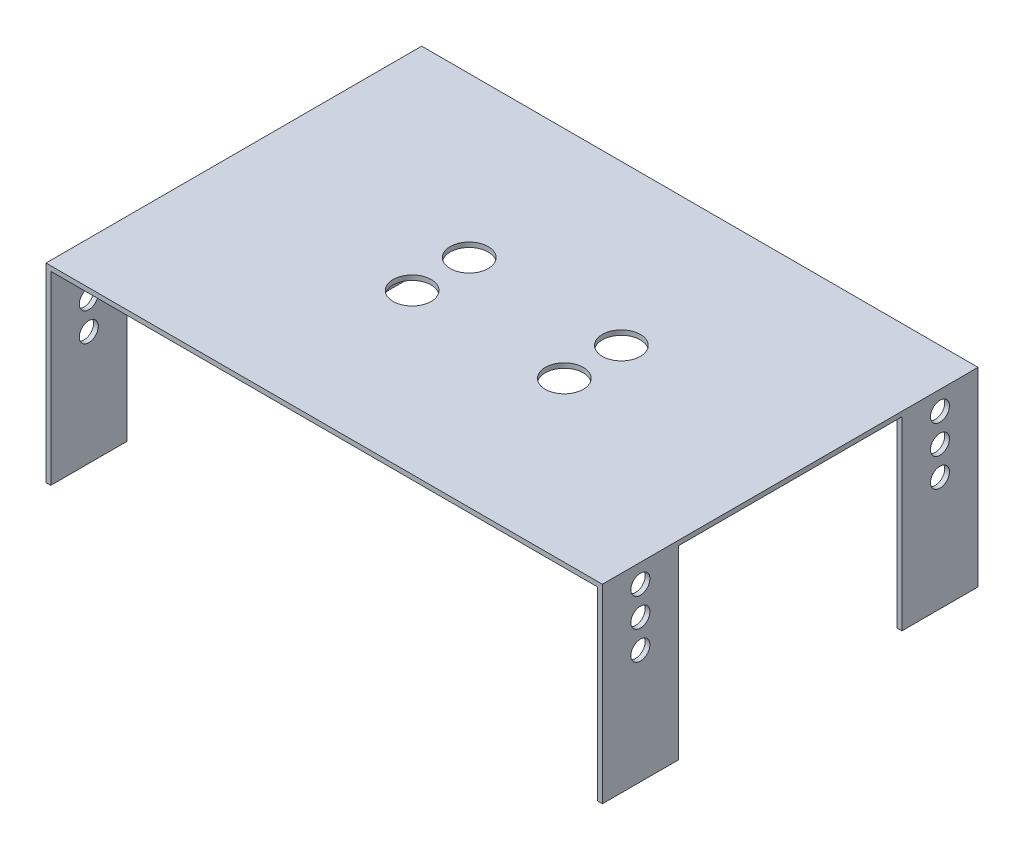
ISO-10303-21;
HEADER;
FILE_DESCRIPTION(('STEP AP214'),'2;1');
FILE_NAME('part.step','',(''),(''),'','','');
FILE_SCHEMA(('AUTOMOTIVE_DESIGN { 1 0 10303 214 1 1 1 1 }'));
ENDSEC;
DATA;
#1=APPLICATION_CONTEXT('core data for automotive mechanical design processes');
#2=APPLICATION_PROTOCOL_DEFINITION('international standard','automotive_design',2000,#1);
#3=PRODUCT_CONTEXT('',#1,'mechanical');
#4=PRODUCT('Part','Part','',(#3));
#5=PRODUCT_RELATED_PRODUCT_CATEGORY('part','',(#4));
#6=PRODUCT_DEFINITION_FORMATION('','',#4);
#7=PRODUCT_DEFINITION_CONTEXT('part definition',#1,'design');
#8=PRODUCT_DEFINITION('design','',#6,#7);
#9=PRODUCT_DEFINITION_SHAPE('','',#8);
#10=(LENGTH_UNIT() NAMED_UNIT(*) SI_UNIT(.MILLI.,.METRE.));
#11=(NAMED_UNIT(*) PLANE_ANGLE_UNIT() SI_UNIT($,.RADIAN.));
#12=(NAMED_UNIT(*) SI_UNIT($,.STERADIAN.) SOLID_ANGLE_UNIT());
#13=UNCERTAINTY_MEASURE_WITH_UNIT(LENGTH_MEASURE(1.E-05),#10,'distance_accuracy_value','');
#14=(GEOMETRIC_REPRESENTATION_CONTEXT(3) GLOBAL_UNCERTAINTY_ASSIGNED_CONTEXT((#13)) GLOBAL_UNIT_ASSIGNED_CONTEXT((#10,
#11,#12)) REPRESENTATION_CONTEXT('',''));
#15=CARTESIAN_POINT('',(0.,0.,0.));
#16=DIRECTION('',(0.,0.,1.));
#17=DIRECTION('',(1.,0.,0.));
#18=AXIS2_PLACEMENT_3D('',#15,#16,#17);
#19=CARTESIAN_POINT('',(0.,-2.5,0.));
#20=DIRECTION('',(0.,1.,0.));
#21=DIRECTION('',(0.,0.,1.));
#22=AXIS2_PLACEMENT_3D('',#19,#20,#21);
#23=PLANE('',#22);
#24=CARTESIAN_POINT('',(-80.,-2.5,30.));
#25=DIRECTION('',(0.,1.,0.));
#26=DIRECTION('',(0.,0.,1.));
#27=AXIS2_PLACEMENT_3D('',#24,#25,#26);
#28=CIRCLE('',#27,20.);
#29=CARTESIAN_POINT('',(-80.,-2.5,50.));
#30=VERTEX_POINT('',#29);
#31=EDGE_CURVE('E474',#30,#30,#28,.T.);
#32=ORIENTED_EDGE('',*,*,#31,.T.);
#33=EDGE_LOOP('',(#32));
#34=FACE_BOUND('',#33,.T.);
#35=CARTESIAN_POINT('',(79.9999999999998,-2.5,30.0000000000005));
#36=DIRECTION('',(0.,1.,0.));
#37=DIRECTION('',(0.,0.,1.));
#38=AXIS2_PLACEMENT_3D('',#35,#36,#37);
#39=CIRCLE('',#38,20.);
#40=CARTESIAN_POINT('',(79.9999999999998,-2.5,50.0000000000005));
#41=VERTEX_POINT('',#40);
#42=EDGE_CURVE('E521',#41,#41,#39,.T.);
#43=ORIENTED_EDGE('',*,*,#42,.T.);
#44=EDGE_LOOP('',(#43));
#45=FACE_BOUND('',#44,.T.);
#46=CARTESIAN_POINT('',(79.9999999999998,-2.5,-30.0000000000005));
#47=DIRECTION('',(0.,1.,0.));
#48=DIRECTION('',(0.,0.,1.));
#49=AXIS2_PLACEMENT_3D('',#46,#47,#48);
#50=CIRCLE('',#49,20.);
#51=CARTESIAN_POINT('',(79.9999999999998,-2.5,-10.0000000000004));
#52=VERTEX_POINT('',#51);
#53=EDGE_CURVE('E524',#52,#52,#50,.T.);
#54=ORIENTED_EDGE('',*,*,#53,.T.);
#55=EDGE_LOOP('',(#54));
#56=FACE_BOUND('',#55,.T.);
#57=CARTESIAN_POINT('',(-80.,-2.5,-30.));
#58=DIRECTION('',(0.,1.,0.));
#59=DIRECTION('',(0.,0.,1.));
#60=AXIS2_PLACEMENT_3D('',#57,#58,#59);
#61=CIRCLE('',#60,20.);
#62=CARTESIAN_POINT('',(-80.,-2.5,-10.));
#63=VERTEX_POINT('',#62);
#64=EDGE_CURVE('E527',#63,#63,#61,.T.);
#65=ORIENTED_EDGE('',*,*,#64,.T.);
#66=EDGE_LOOP('',(#65));
#67=FACE_BOUND('',#66,.T.);
#68=DIRECTION('',(-1.,0.,0.));
#69=VECTOR('',#68,1.);
#70=CARTESIAN_POINT('',(0.,-2.5,-117.501196253295));
#71=LINE('',#70,#69);
#72=CARTESIAN_POINT('',(287.5,-2.5,-117.501196253295));
#73=VERTEX_POINT('',#72);
#74=CARTESIAN_POINT('',(282.5,-2.5,-117.501196253295));
#75=VERTEX_POINT('',#74);
#76=EDGE_CURVE('E193',#73,#75,#71,.T.);
#77=ORIENTED_EDGE('',*,*,#76,.F.);
#78=DIRECTION('',(0.,0.,-1.));
#79=VECTOR('',#78,1.);
#80=CARTESIAN_POINT('',(287.5,-2.5,-197.5));
#81=LINE('',#80,#79);
#82=CARTESIAN_POINT('',(287.5,-2.5,117.501196253295));
#83=VERTEX_POINT('',#82);
#84=EDGE_CURVE('E272',#83,#73,#81,.T.);
#85=ORIENTED_EDGE('',*,*,#84,.F.);
#86=DIRECTION('',(-1.,0.,0.));
#87=VECTOR('',#86,1.);
#88=CARTESIAN_POINT('',(0.,-2.5,117.501196253295));
#89=LINE('',#88,#87);
#90=CARTESIAN_POINT('',(282.5,-2.5,117.501196253295));
#91=VERTEX_POINT('',#90);
#92=EDGE_CURVE('E225',#83,#91,#89,.T.);
#93=ORIENTED_EDGE('',*,*,#92,.T.);
#94=DIRECTION('',(0.,0.,1.));
#95=VECTOR('',#94,1.);
#96=CARTESIAN_POINT('',(282.5,-2.5,-2.95594304467377E-13));
#97=LINE('',#96,#95);
#98=CARTESIAN_POINT('',(282.5,-2.5,197.5));
#99=VERTEX_POINT('',#98);
#100=EDGE_CURVE('E220',#91,#99,#97,.T.);
#101=ORIENTED_EDGE('',*,*,#100,.T.);
#102=DIRECTION('',(1.,0.,0.));
#103=VECTOR('',#102,1.);
#104=CARTESIAN_POINT('',(-297.5,-2.5,197.5));
#105=LINE('',#104,#103);
#106=CARTESIAN_POINT('',(-292.5,-2.5,197.5));
#107=VERTEX_POINT('',#106);
#108=EDGE_CURVE('E276',#107,#99,#105,.T.);
#109=ORIENTED_EDGE('',*,*,#108,.F.);
#110=DIRECTION('',(0.,0.,-1.));
#111=VECTOR('',#110,1.);
#112=CARTESIAN_POINT('',(-292.5,-2.5,-2.02965681668855E-13));
#113=LINE('',#112,#111);
#114=CARTESIAN_POINT('',(-292.5,-2.5,117.501196253295));
#115=VERTEX_POINT('',#114);
#116=EDGE_CURVE('E243',#107,#115,#113,.T.);
#117=ORIENTED_EDGE('',*,*,#116,.T.);
#118=DIRECTION('',(1.,0.,0.));
#119=VECTOR('',#118,1.);
#120=CARTESIAN_POINT('',(0.,-2.5,117.501196253295));
#121=LINE('',#120,#119);
#122=CARTESIAN_POINT('',(-297.5,-2.5,117.501196253295));
#123=VERTEX_POINT('',#122);
#124=EDGE_CURVE('E248',#123,#115,#121,.T.);
#125=ORIENTED_EDGE('',*,*,#124,.F.);
#126=DIRECTION('',(0.,0.,1.));
#127=VECTOR('',#126,1.);
#128=CARTESIAN_POINT('',(-297.5,-2.5,-197.5));
#129=LINE('',#128,#127);
#130=CARTESIAN_POINT('',(-297.5,-2.5,-117.501196253295));
#131=VERTEX_POINT('',#130);
#132=EDGE_CURVE('E286',#131,#123,#129,.T.);
#133=ORIENTED_EDGE('',*,*,#132,.F.);
#134=DIRECTION('',(1.,0.,0.));
#135=VECTOR('',#134,1.);
#136=CARTESIAN_POINT('',(0.,-2.5,-117.501196253295));
#137=LINE('',#136,#135);
#138=CARTESIAN_POINT('',(-292.5,-2.5,-117.501196253295));
#139=VERTEX_POINT('',#138);
#140=EDGE_CURVE('E264',#131,#139,#137,.T.);
#141=ORIENTED_EDGE('',*,*,#140,.T.);
#142=DIRECTION('',(0.,0.,-1.));
#143=VECTOR('',#142,1.);
#144=CARTESIAN_POINT('',(-292.5,-2.5,2.02965681668855E-13));
#145=LINE('',#144,#143);
#146=CARTESIAN_POINT('',(-292.5,-2.5,-197.5));
#147=VERTEX_POINT('',#146);
#148=EDGE_CURVE('E269',#139,#147,#145,.T.);
#149=ORIENTED_EDGE('',*,*,#148,.T.);
#150=DIRECTION('',(-1.,0.,0.));
#151=VECTOR('',#150,1.);
#152=CARTESIAN_POINT('',(-297.5,-2.5,-197.5));
#153=LINE('',#152,#151);
#154=CARTESIAN_POINT('',(282.5,-2.5,-197.5));
#155=VERTEX_POINT('',#154);
#156=EDGE_CURVE('E284',#155,#147,#153,.T.);
#157=ORIENTED_EDGE('',*,*,#156,.F.);
#158=DIRECTION('',(0.,0.,1.));
#159=VECTOR('',#158,1.);
#160=CARTESIAN_POINT('',(282.5,-2.5,0.));
#161=LINE('',#160,#159);
#162=EDGE_CURVE('E202',#155,#75,#161,.T.);
#163=ORIENTED_EDGE('',*,*,#162,.T.);
#164=EDGE_LOOP('',(#77,#85,#93,#101,#109,#117,#125,#133,#141,#149,#157,#163));
#165=FACE_BOUND('',#164,.T.);
#166=ADVANCED_FACE('F52',(#34,#45,#56,#67,#165),#23,.F.);
#167=CARTESIAN_POINT('',(0.,2.5,0.));
#168=DIRECTION('',(0.,1.,0.));
#169=DIRECTION('',(0.,0.,1.));
#170=AXIS2_PLACEMENT_3D('',#167,#168,#169);
#171=PLANE('',#170);
#172=CARTESIAN_POINT('',(-80.,2.5,30.));
#173=DIRECTION('',(0.,1.,0.));
#174=DIRECTION('',(0.,0.,-1.));
#175=AXIS2_PLACEMENT_3D('',#172,#173,#174);
#176=CIRCLE('',#175,20.);
#177=CARTESIAN_POINT('',(-80.,2.5,10.));
#178=VERTEX_POINT('',#177);
#179=EDGE_CURVE('E534',#178,#178,#176,.T.);
#180=ORIENTED_EDGE('',*,*,#179,.F.);
#181=EDGE_LOOP('',(#180));
#182=FACE_BOUND('',#181,.T.);
#183=CARTESIAN_POINT('',(79.9999999999998,2.5,30.0000000000005));
#184=DIRECTION('',(0.,1.,0.));
#185=DIRECTION('',(0.,0.,1.));
#186=AXIS2_PLACEMENT_3D('',#183,#184,#185);
#187=CIRCLE('',#186,20.);
#188=CARTESIAN_POINT('',(79.9999999999998,2.5,50.0000000000005));
#189=VERTEX_POINT('',#188);
#190=EDGE_CURVE('E537',#189,#189,#187,.T.);
#191=ORIENTED_EDGE('',*,*,#190,.F.);
#192=EDGE_LOOP('',(#191));
#193=FACE_BOUND('',#192,.T.);
#194=CARTESIAN_POINT('',(79.9999999999998,2.5,-30.0000000000005));
#195=DIRECTION('',(0.,1.,0.));
#196=DIRECTION('',(0.,0.,-1.));
#197=AXIS2_PLACEMENT_3D('',#194,#195,#196);
#198=CIRCLE('',#197,20.);
#199=CARTESIAN_POINT('',(79.9999999999998,2.5,-50.0000000000005));
#200=VERTEX_POINT('',#199);
#201=EDGE_CURVE('E533',#200,#200,#198,.T.);
#202=ORIENTED_EDGE('',*,*,#201,.F.);
#203=EDGE_LOOP('',(#202));
#204=FACE_BOUND('',#203,.T.);
#205=CARTESIAN_POINT('',(-80.,2.5,-30.));
#206=DIRECTION('',(0.,1.,0.));
#207=DIRECTION('',(0.,0.,1.));
#208=AXIS2_PLACEMENT_3D('',#205,#206,#207);
#209=CIRCLE('',#208,20.);
#210=CARTESIAN_POINT('',(-80.,2.5,-10.));
#211=VERTEX_POINT('',#210);
#212=EDGE_CURVE('E530',#211,#211,#209,.T.);
#213=ORIENTED_EDGE('',*,*,#212,.F.);
#214=EDGE_LOOP('',(#213));
#215=FACE_BOUND('',#214,.T.);
#216=DIRECTION('',(0.,0.,-1.));
#217=VECTOR('',#216,1.);
#218=CARTESIAN_POINT('',(287.5,2.5,-197.5));
#219=LINE('',#218,#217);
#220=CARTESIAN_POINT('',(287.5,2.5,197.5));
#221=VERTEX_POINT('',#220);
#222=CARTESIAN_POINT('',(287.5,2.5,-197.5));
#223=VERTEX_POINT('',#222);
#224=EDGE_CURVE('E273',#221,#223,#219,.T.);
#225=ORIENTED_EDGE('',*,*,#224,.T.);
#226=DIRECTION('',(-1.,0.,0.));
#227=VECTOR('',#226,1.);
#228=CARTESIAN_POINT('',(-297.5,2.5,-197.5));
#229=LINE('',#228,#227);
#230=CARTESIAN_POINT('',(-297.5,2.5,-197.5));
#231=VERTEX_POINT('',#230);
#232=EDGE_CURVE('E275',#223,#231,#229,.T.);
#233=ORIENTED_EDGE('',*,*,#232,.T.);
#234=DIRECTION('',(0.,0.,1.));
#235=VECTOR('',#234,1.);
#236=CARTESIAN_POINT('',(-297.5,2.5,-197.5));
#237=LINE('',#236,#235);
#238=CARTESIAN_POINT('',(-297.5,2.5,197.5));
#239=VERTEX_POINT('',#238);
#240=EDGE_CURVE('E278',#231,#239,#237,.T.);
#241=ORIENTED_EDGE('',*,*,#240,.T.);
#242=DIRECTION('',(1.,0.,0.));
#243=VECTOR('',#242,1.);
#244=CARTESIAN_POINT('',(-297.5,2.5,197.5));
#245=LINE('',#244,#243);
#246=EDGE_CURVE('E280',#239,#221,#245,.T.);
#247=ORIENTED_EDGE('',*,*,#246,.T.);
#248=EDGE_LOOP('',(#225,#233,#241,#247));
#249=FACE_BOUND('',#248,.T.);
#250=ADVANCED_FACE('F363',(#182,#193,#204,#215,#249),#171,.T.);
#251=CARTESIAN_POINT('',(287.5,2.5,-197.5));
#252=DIRECTION('',(-1.,0.,0.));
#253=DIRECTION('',(0.,0.,1.));
#254=AXIS2_PLACEMENT_3D('',#251,#252,#253);
#255=PLANE('',#254);
#256=CARTESIAN_POINT('',(287.5,-47.5,-157.500598126648));
#257=DIRECTION('',(-1.,0.,0.));
#258=DIRECTION('',(0.,0.,1.));
#259=AXIS2_PLACEMENT_3D('',#256,#257,#258);
#260=CIRCLE('',#259,10.);
#261=CARTESIAN_POINT('',(287.5,-47.5,-147.500598126648));
#262=VERTEX_POINT('',#261);
#263=EDGE_CURVE('E480',#262,#262,#260,.T.);
#264=ORIENTED_EDGE('',*,*,#263,.T.);
#265=EDGE_LOOP('',(#264));
#266=FACE_BOUND('',#265,.T.);
#267=CARTESIAN_POINT('',(287.5,-77.5,-157.500598126648));
#268=DIRECTION('',(-1.,0.,0.));
#269=DIRECTION('',(0.,0.,1.));
#270=AXIS2_PLACEMENT_3D('',#267,#268,#269);
#271=CIRCLE('',#270,10.);
#272=CARTESIAN_POINT('',(287.5,-77.5,-147.500598126648));
#273=VERTEX_POINT('',#272);
#274=EDGE_CURVE('E471',#273,#273,#271,.T.);
#275=ORIENTED_EDGE('',*,*,#274,.T.);
#276=EDGE_LOOP('',(#275));
#277=FACE_BOUND('',#276,.T.);
#278=CARTESIAN_POINT('',(287.5,-17.5,157.500598126647));
#279=DIRECTION('',(-1.,0.,0.));
#280=DIRECTION('',(0.,0.,1.));
#281=AXIS2_PLACEMENT_3D('',#278,#279,#280);
#282=CIRCLE('',#281,10.);
#283=CARTESIAN_POINT('',(287.5,-17.5,167.500598126647));
#284=VERTEX_POINT('',#283);
#285=EDGE_CURVE('E467',#284,#284,#282,.T.);
#286=ORIENTED_EDGE('',*,*,#285,.T.);
#287=EDGE_LOOP('',(#286));
#288=FACE_BOUND('',#287,.T.);
#289=CARTESIAN_POINT('',(287.5,-47.5,157.500598126647));
#290=DIRECTION('',(-1.,0.,0.));
#291=DIRECTION('',(0.,0.,1.));
#292=AXIS2_PLACEMENT_3D('',#289,#290,#291);
#293=CIRCLE('',#292,10.);
#294=CARTESIAN_POINT('',(287.5,-47.5,167.500598126647));
#295=VERTEX_POINT('',#294);
#296=EDGE_CURVE('E465',#295,#295,#293,.T.);
#297=ORIENTED_EDGE('',*,*,#296,.T.);
#298=EDGE_LOOP('',(#297));
#299=FACE_BOUND('',#298,.T.);
#300=CARTESIAN_POINT('',(287.5,-77.5,157.500598126647));
#301=DIRECTION('',(-1.,0.,0.));
#302=DIRECTION('',(0.,0.,1.));
#303=AXIS2_PLACEMENT_3D('',#300,#301,#302);
#304=CIRCLE('',#303,10.);
#305=CARTESIAN_POINT('',(287.5,-77.5,167.500598126647));
#306=VERTEX_POINT('',#305);
#307=EDGE_CURVE('E468',#306,#306,#304,.T.);
#308=ORIENTED_EDGE('',*,*,#307,.T.);
#309=EDGE_LOOP('',(#308));
#310=FACE_BOUND('',#309,.T.);
#311=CARTESIAN_POINT('',(287.5,-17.5,-157.500598126648));
#312=DIRECTION('',(-1.,0.,0.));
#313=DIRECTION('',(0.,0.,1.));
#314=AXIS2_PLACEMENT_3D('',#311,#312,#313);
#315=CIRCLE('',#314,10.);
#316=CARTESIAN_POINT('',(287.5,-17.5,-147.500598126648));
#317=VERTEX_POINT('',#316);
#318=EDGE_CURVE('E298',#317,#317,#315,.T.);
#319=ORIENTED_EDGE('',*,*,#318,.T.);
#320=EDGE_LOOP('',(#319));
#321=FACE_BOUND('',#320,.T.);
#322=DIRECTION('',(0.,-1.,0.));
#323=VECTOR('',#322,1.);
#324=CARTESIAN_POINT('',(287.5,2.5,-197.5));
#325=LINE('',#324,#323);
#326=CARTESIAN_POINT('',(287.5,-197.5,-197.5));
#327=VERTEX_POINT('',#326);
#328=EDGE_CURVE('E13',#223,#327,#325,.T.);
#329=ORIENTED_EDGE('',*,*,#328,.F.);
#330=ORIENTED_EDGE('',*,*,#224,.F.);
#331=DIRECTION('',(0.,-1.,0.));
#332=VECTOR('',#331,1.);
#333=CARTESIAN_POINT('',(287.5,2.5,197.5));
#334=LINE('',#333,#332);
#335=CARTESIAN_POINT('',(287.5,-197.5,197.5));
#336=VERTEX_POINT('',#335);
#337=EDGE_CURVE('E282',#221,#336,#334,.T.);
#338=ORIENTED_EDGE('',*,*,#337,.T.);
#339=DIRECTION('',(0.,0.,-1.));
#340=VECTOR('',#339,1.);
#341=CARTESIAN_POINT('',(287.5,-197.5,117.501196253295));
#342=LINE('',#341,#340);
#343=CARTESIAN_POINT('',(287.5,-197.5,117.501196253295));
#344=VERTEX_POINT('',#343);
#345=EDGE_CURVE('E206',#336,#344,#342,.T.);
#346=ORIENTED_EDGE('',*,*,#345,.T.);
#347=DIRECTION('',(0.,1.,0.));
#348=VECTOR('',#347,1.);
#349=CARTESIAN_POINT('',(287.5,2.5,117.501196253295));
#350=LINE('',#349,#348);
#351=EDGE_CURVE('E69',#344,#83,#350,.T.);
#352=ORIENTED_EDGE('',*,*,#351,.T.);
#353=ORIENTED_EDGE('',*,*,#84,.T.);
#354=DIRECTION('',(0.,1.,0.));
#355=VECTOR('',#354,1.);
#356=CARTESIAN_POINT('',(287.5,2.5,-117.501196253295));
#357=LINE('',#356,#355);
#358=CARTESIAN_POINT('',(287.5,-197.5,-117.501196253295));
#359=VERTEX_POINT('',#358);
#360=EDGE_CURVE('E198',#359,#73,#357,.T.);
#361=ORIENTED_EDGE('',*,*,#360,.F.);
#362=DIRECTION('',(0.,0.,1.));
#363=VECTOR('',#362,1.);
#364=CARTESIAN_POINT('',(287.5,-197.5,-117.501196253295));
#365=LINE('',#364,#363);
#366=EDGE_CURVE('E186',#327,#359,#365,.T.);
#367=ORIENTED_EDGE('',*,*,#366,.F.);
#368=EDGE_LOOP('',(#329,#330,#338,#346,#352,#353,#361,#367));
#369=FACE_BOUND('',#368,.T.);
#370=ADVANCED_FACE('F54',(#266,#277,#288,#299,#310,#321,#369),#255,.F.);
#371=CARTESIAN_POINT('',(-297.5,2.5,-197.5));
#372=DIRECTION('',(0.,0.,1.));
#373=DIRECTION('',(1.,0.,0.));
#374=AXIS2_PLACEMENT_3D('',#371,#372,#373);
#375=PLANE('',#374);
#376=DIRECTION('',(0.,-1.,0.));
#377=VECTOR('',#376,1.);
#378=CARTESIAN_POINT('',(-297.5,2.5,-197.5));
#379=LINE('',#378,#377);
#380=CARTESIAN_POINT('',(-297.5,-197.5,-197.5));
#381=VERTEX_POINT('',#380);
#382=EDGE_CURVE('E61',#231,#381,#379,.T.);
#383=ORIENTED_EDGE('',*,*,#382,.F.);
#384=ORIENTED_EDGE('',*,*,#232,.F.);
#385=ORIENTED_EDGE('',*,*,#328,.T.);
#386=DIRECTION('',(1.,0.,0.));
#387=VECTOR('',#386,1.);
#388=CARTESIAN_POINT('',(282.5,-197.5,-197.5));
#389=LINE('',#388,#387);
#390=CARTESIAN_POINT('',(282.5,-197.5,-197.5));
#391=VERTEX_POINT('',#390);
#392=EDGE_CURVE('E189',#391,#327,#389,.T.);
#393=ORIENTED_EDGE('',*,*,#392,.F.);
#394=DIRECTION('',(0.,-1.,0.));
#395=VECTOR('',#394,1.);
#396=CARTESIAN_POINT('',(282.5,-197.5,-197.5));
#397=LINE('',#396,#395);
#398=EDGE_CURVE('E177',#155,#391,#397,.T.);
#399=ORIENTED_EDGE('',*,*,#398,.F.);
#400=ORIENTED_EDGE('',*,*,#156,.T.);
#401=DIRECTION('',(0.,-1.,0.));
#402=VECTOR('',#401,1.);
#403=CARTESIAN_POINT('',(-292.5,-197.5,-197.5));
#404=LINE('',#403,#402);
#405=CARTESIAN_POINT('',(-292.5,-197.5,-197.5));
#406=VERTEX_POINT('',#405);
#407=EDGE_CURVE('E251',#147,#406,#404,.T.);
#408=ORIENTED_EDGE('',*,*,#407,.T.);
#409=DIRECTION('',(-1.,0.,0.));
#410=VECTOR('',#409,1.);
#411=CARTESIAN_POINT('',(-292.5,-197.5,-197.5));
#412=LINE('',#411,#410);
#413=EDGE_CURVE('E259',#406,#381,#412,.T.);
#414=ORIENTED_EDGE('',*,*,#413,.T.);
#415=EDGE_LOOP('',(#383,#384,#385,#393,#399,#400,#408,#414));
#416=FACE_BOUND('',#415,.T.);
#417=ADVANCED_FACE('F381',(#416),#375,.F.);
#418=CARTESIAN_POINT('',(-297.5,2.5,-197.5));
#419=DIRECTION('',(1.,0.,0.));
#420=DIRECTION('',(0.,0.,-1.));
#421=AXIS2_PLACEMENT_3D('',#418,#419,#420);
#422=PLANE('',#421);
#423=CARTESIAN_POINT('',(-297.5,-47.5,-157.500598126648));
#424=DIRECTION('',(1.,0.,0.));
#425=DIRECTION('',(0.,0.,-1.));
#426=AXIS2_PLACEMENT_3D('',#423,#424,#425);
#427=CIRCLE('',#426,10.);
#428=CARTESIAN_POINT('',(-297.5,-47.5,-167.500598126648));
#429=VERTEX_POINT('',#428);
#430=EDGE_CURVE('E312',#429,#429,#427,.T.);
#431=ORIENTED_EDGE('',*,*,#430,.T.);
#432=EDGE_LOOP('',(#431));
#433=FACE_BOUND('',#432,.T.);
#434=CARTESIAN_POINT('',(-297.5,-77.5,-157.500598126648));
#435=DIRECTION('',(1.,0.,0.));
#436=DIRECTION('',(0.,0.,-1.));
#437=AXIS2_PLACEMENT_3D('',#434,#435,#436);
#438=CIRCLE('',#437,10.);
#439=CARTESIAN_POINT('',(-297.5,-77.5,-167.500598126648));
#440=VERTEX_POINT('',#439);
#441=EDGE_CURVE('E308',#440,#440,#438,.T.);
#442=ORIENTED_EDGE('',*,*,#441,.T.);
#443=EDGE_LOOP('',(#442));
#444=FACE_BOUND('',#443,.T.);
#445=CARTESIAN_POINT('',(-297.5,-17.5,157.500598126648));
#446=DIRECTION('',(1.,0.,0.));
#447=DIRECTION('',(0.,0.,-1.));
#448=AXIS2_PLACEMENT_3D('',#445,#446,#447);
#449=CIRCLE('',#448,10.);
#450=CARTESIAN_POINT('',(-297.5,-17.5,147.500598126648));
#451=VERTEX_POINT('',#450);
#452=EDGE_CURVE('E200',#451,#451,#449,.T.);
#453=ORIENTED_EDGE('',*,*,#452,.T.);
#454=EDGE_LOOP('',(#453));
#455=FACE_BOUND('',#454,.T.);
#456=CARTESIAN_POINT('',(-297.5,-47.5,157.500598126648));
#457=DIRECTION('',(1.,0.,0.));
#458=DIRECTION('',(0.,0.,-1.));
#459=AXIS2_PLACEMENT_3D('',#456,#457,#458);
#460=CIRCLE('',#459,10.);
#461=CARTESIAN_POINT('',(-297.5,-47.5,147.500598126648));
#462=VERTEX_POINT('',#461);
#463=EDGE_CURVE('E320',#462,#462,#460,.T.);
#464=ORIENTED_EDGE('',*,*,#463,.T.);
#465=EDGE_LOOP('',(#464));
#466=FACE_BOUND('',#465,.T.);
#467=CARTESIAN_POINT('',(-297.5,-77.5,157.500598126648));
#468=DIRECTION('',(1.,0.,0.));
#469=DIRECTION('',(0.,0.,-1.));
#470=AXIS2_PLACEMENT_3D('',#467,#468,#469);
#471=CIRCLE('',#470,10.);
#472=CARTESIAN_POINT('',(-297.5,-77.5,147.500598126648));
#473=VERTEX_POINT('',#472);
#474=EDGE_CURVE('E316',#473,#473,#471,.T.);
#475=ORIENTED_EDGE('',*,*,#474,.T.);
#476=EDGE_LOOP('',(#475));
#477=FACE_BOUND('',#476,.T.);
#478=CARTESIAN_POINT('',(-297.5,-17.5,-157.500598126648));
#479=DIRECTION('',(1.,0.,0.));
#480=DIRECTION('',(0.,0.,-1.));
#481=AXIS2_PLACEMENT_3D('',#478,#479,#480);
#482=CIRCLE('',#481,10.);
#483=CARTESIAN_POINT('',(-297.5,-17.5,-167.500598126648));
#484=VERTEX_POINT('',#483);
#485=EDGE_CURVE('E303',#484,#484,#482,.T.);
#486=ORIENTED_EDGE('',*,*,#485,.T.);
#487=EDGE_LOOP('',(#486));
#488=FACE_BOUND('',#487,.T.);
#489=DIRECTION('',(0.,-1.,0.));
#490=VECTOR('',#489,1.);
#491=CARTESIAN_POINT('',(-297.5,2.5,197.5));
#492=LINE('',#491,#490);
#493=CARTESIAN_POINT('',(-297.5,-197.5,197.5));
#494=VERTEX_POINT('',#493);
#495=EDGE_CURVE('E291',#239,#494,#492,.T.);
#496=ORIENTED_EDGE('',*,*,#495,.F.);
#497=ORIENTED_EDGE('',*,*,#240,.F.);
#498=ORIENTED_EDGE('',*,*,#382,.T.);
#499=DIRECTION('',(0.,0.,1.));
#500=VECTOR('',#499,1.);
#501=CARTESIAN_POINT('',(-297.5,-197.5,-117.501196253295));
#502=LINE('',#501,#500);
#503=CARTESIAN_POINT('',(-297.5,-197.5,-117.501196253295));
#504=VERTEX_POINT('',#503);
#505=EDGE_CURVE('E250',#381,#504,#502,.T.);
#506=ORIENTED_EDGE('',*,*,#505,.T.);
#507=DIRECTION('',(0.,1.,0.));
#508=VECTOR('',#507,1.);
#509=CARTESIAN_POINT('',(-297.5,2.5,-117.501196253295));
#510=LINE('',#509,#508);
#511=EDGE_CURVE('E77',#504,#131,#510,.T.);
#512=ORIENTED_EDGE('',*,*,#511,.T.);
#513=ORIENTED_EDGE('',*,*,#132,.T.);
#514=DIRECTION('',(0.,1.,0.));
#515=VECTOR('',#514,1.);
#516=CARTESIAN_POINT('',(-297.5,2.5,117.501196253295));
#517=LINE('',#516,#515);
#518=CARTESIAN_POINT('',(-297.5,-197.5,117.501196253295));
#519=VERTEX_POINT('',#518);
#520=EDGE_CURVE('E228',#519,#123,#517,.T.);
#521=ORIENTED_EDGE('',*,*,#520,.F.);
#522=DIRECTION('',(0.,0.,-1.));
#523=VECTOR('',#522,1.);
#524=CARTESIAN_POINT('',(-297.5,-197.5,117.501196253295));
#525=LINE('',#524,#523);
#526=EDGE_CURVE('E232',#494,#519,#525,.T.);
#527=ORIENTED_EDGE('',*,*,#526,.F.);
#528=EDGE_LOOP('',(#496,#497,#498,#506,#512,#513,#521,#527));
#529=FACE_BOUND('',#528,.T.);
#530=ADVANCED_FACE('F337',(#433,#444,#455,#466,#477,#488,#529),#422,.F.);
#531=CARTESIAN_POINT('',(-297.5,2.5,197.5));
#532=DIRECTION('',(0.,0.,-1.));
#533=DIRECTION('',(-1.,0.,0.));
#534=AXIS2_PLACEMENT_3D('',#531,#532,#533);
#535=PLANE('',#534);
#536=ORIENTED_EDGE('',*,*,#108,.T.);
#537=DIRECTION('',(0.,-1.,0.));
#538=VECTOR('',#537,1.);
#539=CARTESIAN_POINT('',(282.5,-197.5,197.5));
#540=LINE('',#539,#538);
#541=CARTESIAN_POINT('',(282.5,-197.5,197.5));
#542=VERTEX_POINT('',#541);
#543=EDGE_CURVE('E207',#99,#542,#540,.T.);
#544=ORIENTED_EDGE('',*,*,#543,.T.);
#545=DIRECTION('',(1.,0.,0.));
#546=VECTOR('',#545,1.);
#547=CARTESIAN_POINT('',(282.5,-197.5,197.5));
#548=LINE('',#547,#546);
#549=EDGE_CURVE('E215',#542,#336,#548,.T.);
#550=ORIENTED_EDGE('',*,*,#549,.T.);
#551=ORIENTED_EDGE('',*,*,#337,.F.);
#552=ORIENTED_EDGE('',*,*,#246,.F.);
#553=ORIENTED_EDGE('',*,*,#495,.T.);
#554=DIRECTION('',(-1.,0.,0.));
#555=VECTOR('',#554,1.);
#556=CARTESIAN_POINT('',(-292.5,-197.5,197.5));
#557=LINE('',#556,#555);
#558=CARTESIAN_POINT('',(-292.5,-197.5,197.5));
#559=VERTEX_POINT('',#558);
#560=EDGE_CURVE('E240',#559,#494,#557,.T.);
#561=ORIENTED_EDGE('',*,*,#560,.F.);
#562=DIRECTION('',(0.,-1.,0.));
#563=VECTOR('',#562,1.);
#564=CARTESIAN_POINT('',(-292.5,-197.5,197.5));
#565=LINE('',#564,#563);
#566=EDGE_CURVE('E229',#107,#559,#565,.T.);
#567=ORIENTED_EDGE('',*,*,#566,.F.);
#568=EDGE_LOOP('',(#536,#544,#550,#551,#552,#553,#561,#567));
#569=FACE_BOUND('',#568,.T.);
#570=ADVANCED_FACE('F375',(#569),#535,.F.);
#571=CARTESIAN_POINT('',(-292.5,0.,2.05732507700405E-13));
#572=DIRECTION('',(1.,0.,0.));
#573=DIRECTION('',(0.,0.,-1.));
#574=AXIS2_PLACEMENT_3D('',#571,#572,#573);
#575=PLANE('',#574);
#576=CARTESIAN_POINT('',(-292.5,-47.5,-157.500598126648));
#577=DIRECTION('',(1.,0.,0.));
#578=DIRECTION('',(0.,0.,-1.));
#579=AXIS2_PLACEMENT_3D('',#576,#577,#578);
#580=CIRCLE('',#579,10.);
#581=CARTESIAN_POINT('',(-292.5,-47.5,-167.500598126648));
#582=VERTEX_POINT('',#581);
#583=EDGE_CURVE('E307',#582,#582,#580,.T.);
#584=ORIENTED_EDGE('',*,*,#583,.F.);
#585=EDGE_LOOP('',(#584));
#586=FACE_BOUND('',#585,.T.);
#587=CARTESIAN_POINT('',(-292.5,-77.5,-157.500598126648));
#588=DIRECTION('',(1.,0.,0.));
#589=DIRECTION('',(0.,0.,-1.));
#590=AXIS2_PLACEMENT_3D('',#587,#588,#589);
#591=CIRCLE('',#590,10.);
#592=CARTESIAN_POINT('',(-292.5,-77.5,-167.500598126648));
#593=VERTEX_POINT('',#592);
#594=EDGE_CURVE('E302',#593,#593,#591,.T.);
#595=ORIENTED_EDGE('',*,*,#594,.F.);
#596=EDGE_LOOP('',(#595));
#597=FACE_BOUND('',#596,.T.);
#598=CARTESIAN_POINT('',(-292.5,-17.5,-157.500598126648));
#599=DIRECTION('',(1.,0.,0.));
#600=DIRECTION('',(0.,0.,-1.));
#601=AXIS2_PLACEMENT_3D('',#598,#599,#600);
#602=CIRCLE('',#601,10.);
#603=CARTESIAN_POINT('',(-292.5,-17.5,-167.500598126648));
#604=VERTEX_POINT('',#603);
#605=EDGE_CURVE('E297',#604,#604,#602,.T.);
#606=ORIENTED_EDGE('',*,*,#605,.F.);
#607=EDGE_LOOP('',(#606));
#608=FACE_BOUND('',#607,.T.);
#609=ORIENTED_EDGE('',*,*,#148,.F.);
#610=DIRECTION('',(0.,1.,0.));
#611=VECTOR('',#610,1.);
#612=CARTESIAN_POINT('',(-292.5,2.5,-117.501196253295));
#613=LINE('',#612,#611);
#614=CARTESIAN_POINT('',(-292.5,-197.5,-117.501196253295));
#615=VERTEX_POINT('',#614);
#616=EDGE_CURVE('E256',#615,#139,#613,.T.);
#617=ORIENTED_EDGE('',*,*,#616,.F.);
#618=DIRECTION('',(0.,0.,1.));
#619=VECTOR('',#618,1.);
#620=CARTESIAN_POINT('',(-292.5,-197.5,-117.501196253295));
#621=LINE('',#620,#619);
#622=EDGE_CURVE('E253',#406,#615,#621,.T.);
#623=ORIENTED_EDGE('',*,*,#622,.F.);
#624=ORIENTED_EDGE('',*,*,#407,.F.);
#625=EDGE_LOOP('',(#609,#617,#623,#624));
#626=FACE_BOUND('',#625,.T.);
#627=ADVANCED_FACE('F378',(#586,#597,#608,#626),#575,.T.);
#628=CARTESIAN_POINT('',(-292.5,2.5,-117.501196253295));
#629=DIRECTION('',(0.,0.,1.));
#630=DIRECTION('',(1.,0.,0.));
#631=AXIS2_PLACEMENT_3D('',#628,#629,#630);
#632=PLANE('',#631);
#633=ORIENTED_EDGE('',*,*,#140,.F.);
#634=ORIENTED_EDGE('',*,*,#511,.F.);
#635=DIRECTION('',(-1.,0.,0.));
#636=VECTOR('',#635,1.);
#637=CARTESIAN_POINT('',(-292.5,-197.5,-117.501196253295));
#638=LINE('',#637,#636);
#639=EDGE_CURVE('E262',#615,#504,#638,.T.);
#640=ORIENTED_EDGE('',*,*,#639,.F.);
#641=ORIENTED_EDGE('',*,*,#616,.T.);
#642=EDGE_LOOP('',(#633,#634,#640,#641));
#643=FACE_BOUND('',#642,.T.);
#644=ADVANCED_FACE('F409',(#643),#632,.T.);
#645=CARTESIAN_POINT('',(-292.5,-197.5,-117.501196253295));
#646=DIRECTION('',(0.,-1.,0.));
#647=DIRECTION('',(0.,0.,-1.));
#648=AXIS2_PLACEMENT_3D('',#645,#646,#647);
#649=PLANE('',#648);
#650=ORIENTED_EDGE('',*,*,#505,.F.);
#651=ORIENTED_EDGE('',*,*,#413,.F.);
#652=ORIENTED_EDGE('',*,*,#622,.T.);
#653=ORIENTED_EDGE('',*,*,#639,.T.);
#654=EDGE_LOOP('',(#650,#651,#652,#653));
#655=FACE_BOUND('',#654,.T.);
#656=ADVANCED_FACE('F411',(#655),#649,.T.);
#657=CARTESIAN_POINT('',(-292.5,2.5,117.501196253295));
#658=DIRECTION('',(0.,0.,1.));
#659=DIRECTION('',(1.,0.,0.));
#660=AXIS2_PLACEMENT_3D('',#657,#658,#659);
#661=PLANE('',#660);
#662=ORIENTED_EDGE('',*,*,#520,.T.);
#663=ORIENTED_EDGE('',*,*,#124,.T.);
#664=DIRECTION('',(0.,1.,0.));
#665=VECTOR('',#664,1.);
#666=CARTESIAN_POINT('',(-292.5,2.5,117.501196253295));
#667=LINE('',#666,#665);
#668=CARTESIAN_POINT('',(-292.5,-197.5,117.501196253295));
#669=VERTEX_POINT('',#668);
#670=EDGE_CURVE('E231',#669,#115,#667,.T.);
#671=ORIENTED_EDGE('',*,*,#670,.F.);
#672=DIRECTION('',(-1.,0.,0.));
#673=VECTOR('',#672,1.);
#674=CARTESIAN_POINT('',(-292.5,-197.5,117.501196253295));
#675=LINE('',#674,#673);
#676=EDGE_CURVE('E237',#669,#519,#675,.T.);
#677=ORIENTED_EDGE('',*,*,#676,.T.);
#678=EDGE_LOOP('',(#662,#663,#671,#677));
#679=FACE_BOUND('',#678,.T.);
#680=ADVANCED_FACE('F413',(#679),#661,.F.);
#681=CARTESIAN_POINT('',(-292.5,0.,-2.05732507700405E-13));
#682=DIRECTION('',(1.,0.,0.));
#683=DIRECTION('',(0.,0.,1.));
#684=AXIS2_PLACEMENT_3D('',#681,#682,#683);
#685=PLANE('',#684);
#686=CARTESIAN_POINT('',(-292.5,-17.5,157.500598126648));
#687=DIRECTION('',(1.,0.,0.));
#688=DIRECTION('',(0.,0.,-1.));
#689=AXIS2_PLACEMENT_3D('',#686,#687,#688);
#690=CIRCLE('',#689,10.);
#691=CARTESIAN_POINT('',(-292.5,-17.5,147.500598126648));
#692=VERTEX_POINT('',#691);
#693=EDGE_CURVE('E332',#692,#692,#690,.T.);
#694=ORIENTED_EDGE('',*,*,#693,.F.);
#695=EDGE_LOOP('',(#694));
#696=FACE_BOUND('',#695,.T.);
#697=CARTESIAN_POINT('',(-292.5,-47.5,157.500598126648));
#698=DIRECTION('',(1.,0.,0.));
#699=DIRECTION('',(0.,0.,-1.));
#700=AXIS2_PLACEMENT_3D('',#697,#698,#699);
#701=CIRCLE('',#700,10.);
#702=CARTESIAN_POINT('',(-292.5,-47.5,147.500598126648));
#703=VERTEX_POINT('',#702);
#704=EDGE_CURVE('E315',#703,#703,#701,.T.);
#705=ORIENTED_EDGE('',*,*,#704,.F.);
#706=EDGE_LOOP('',(#705));
#707=FACE_BOUND('',#706,.T.);
#708=CARTESIAN_POINT('',(-292.5,-77.5,157.500598126648));
#709=DIRECTION('',(1.,0.,0.));
#710=DIRECTION('',(0.,0.,-1.));
#711=AXIS2_PLACEMENT_3D('',#708,#709,#710);
#712=CIRCLE('',#711,10.);
#713=CARTESIAN_POINT('',(-292.5,-77.5,147.500598126648));
#714=VERTEX_POINT('',#713);
#715=EDGE_CURVE('E311',#714,#714,#712,.T.);
#716=ORIENTED_EDGE('',*,*,#715,.F.);
#717=EDGE_LOOP('',(#716));
#718=FACE_BOUND('',#717,.T.);
#719=ORIENTED_EDGE('',*,*,#116,.F.);
#720=ORIENTED_EDGE('',*,*,#566,.T.);
#721=DIRECTION('',(0.,0.,-1.));
#722=VECTOR('',#721,1.);
#723=CARTESIAN_POINT('',(-292.5,-197.5,117.501196253295));
#724=LINE('',#723,#722);
#725=EDGE_CURVE('E235',#559,#669,#724,.T.);
#726=ORIENTED_EDGE('',*,*,#725,.T.);
#727=ORIENTED_EDGE('',*,*,#670,.T.);
#728=EDGE_LOOP('',(#719,#720,#726,#727));
#729=FACE_BOUND('',#728,.T.);
#730=ADVANCED_FACE('F418',(#696,#707,#718,#729),#685,.T.);
#731=CARTESIAN_POINT('',(-292.5,-197.5,117.501196253295));
#732=DIRECTION('',(0.,1.,0.));
#733=DIRECTION('',(0.,0.,1.));
#734=AXIS2_PLACEMENT_3D('',#731,#732,#733);
#735=PLANE('',#734);
#736=ORIENTED_EDGE('',*,*,#526,.T.);
#737=ORIENTED_EDGE('',*,*,#676,.F.);
#738=ORIENTED_EDGE('',*,*,#725,.F.);
#739=ORIENTED_EDGE('',*,*,#560,.T.);
#740=EDGE_LOOP('',(#736,#737,#738,#739));
#741=FACE_BOUND('',#740,.T.);
#742=ADVANCED_FACE('F426',(#741),#735,.F.);
#743=CARTESIAN_POINT('',(282.5,2.5,117.501196253295));
#744=DIRECTION('',(0.,0.,-1.));
#745=DIRECTION('',(-1.,0.,0.));
#746=AXIS2_PLACEMENT_3D('',#743,#744,#745);
#747=PLANE('',#746);
#748=ORIENTED_EDGE('',*,*,#92,.F.);
#749=ORIENTED_EDGE('',*,*,#351,.F.);
#750=DIRECTION('',(1.,0.,0.));
#751=VECTOR('',#750,1.);
#752=CARTESIAN_POINT('',(282.5,-197.5,117.501196253295));
#753=LINE('',#752,#751);
#754=CARTESIAN_POINT('',(282.5,-197.5,117.501196253295));
#755=VERTEX_POINT('',#754);
#756=EDGE_CURVE('E218',#755,#344,#753,.T.);
#757=ORIENTED_EDGE('',*,*,#756,.F.);
#758=DIRECTION('',(0.,1.,0.));
#759=VECTOR('',#758,1.);
#760=CARTESIAN_POINT('',(282.5,2.5,117.501196253295));
#761=LINE('',#760,#759);
#762=EDGE_CURVE('E212',#755,#91,#761,.T.);
#763=ORIENTED_EDGE('',*,*,#762,.T.);
#764=EDGE_LOOP('',(#748,#749,#757,#763));
#765=FACE_BOUND('',#764,.T.);
#766=ADVANCED_FACE('F429',(#765),#747,.T.);
#767=CARTESIAN_POINT('',(282.5,0.,-3.07062386932066E-13));
#768=DIRECTION('',(-1.,0.,0.));
#769=DIRECTION('',(0.,0.,1.));
#770=AXIS2_PLACEMENT_3D('',#767,#768,#769);
#771=PLANE('',#770);
#772=CARTESIAN_POINT('',(282.5,-17.5,157.500598126647));
#773=DIRECTION('',(-1.,0.,0.));
#774=DIRECTION('',(0.,0.,1.));
#775=AXIS2_PLACEMENT_3D('',#772,#773,#774);
#776=CIRCLE('',#775,10.);
#777=CARTESIAN_POINT('',(282.5,-17.5,167.500598126647));
#778=VERTEX_POINT('',#777);
#779=EDGE_CURVE('E56',#778,#778,#776,.T.);
#780=ORIENTED_EDGE('',*,*,#779,.F.);
#781=EDGE_LOOP('',(#780));
#782=FACE_BOUND('',#781,.T.);
#783=CARTESIAN_POINT('',(282.5,-47.5,157.500598126647));
#784=DIRECTION('',(-1.,0.,0.));
#785=DIRECTION('',(0.,0.,1.));
#786=AXIS2_PLACEMENT_3D('',#783,#784,#785);
#787=CIRCLE('',#786,10.);
#788=CARTESIAN_POINT('',(282.5,-47.5,167.500598126647));
#789=VERTEX_POINT('',#788);
#790=EDGE_CURVE('E313',#789,#789,#787,.T.);
#791=ORIENTED_EDGE('',*,*,#790,.F.);
#792=EDGE_LOOP('',(#791));
#793=FACE_BOUND('',#792,.T.);
#794=CARTESIAN_POINT('',(282.5,-77.5,157.500598126647));
#795=DIRECTION('',(-1.,0.,0.));
#796=DIRECTION('',(0.,0.,1.));
#797=AXIS2_PLACEMENT_3D('',#794,#795,#796);
#798=CIRCLE('',#797,10.);
#799=CARTESIAN_POINT('',(282.5,-77.5,167.500598126647));
#800=VERTEX_POINT('',#799);
#801=EDGE_CURVE('E309',#800,#800,#798,.T.);
#802=ORIENTED_EDGE('',*,*,#801,.F.);
#803=EDGE_LOOP('',(#802));
#804=FACE_BOUND('',#803,.T.);
#805=ORIENTED_EDGE('',*,*,#100,.F.);
#806=ORIENTED_EDGE('',*,*,#762,.F.);
#807=DIRECTION('',(0.,0.,-1.));
#808=VECTOR('',#807,1.);
#809=CARTESIAN_POINT('',(282.5,-197.5,117.501196253295));
#810=LINE('',#809,#808);
#811=EDGE_CURVE('E209',#542,#755,#810,.T.);
#812=ORIENTED_EDGE('',*,*,#811,.F.);
#813=ORIENTED_EDGE('',*,*,#543,.F.);
#814=EDGE_LOOP('',(#805,#806,#812,#813));
#815=FACE_BOUND('',#814,.T.);
#816=ADVANCED_FACE('F437',(#782,#793,#804,#815),#771,.T.);
#817=CARTESIAN_POINT('',(282.5,-197.5,117.501196253295));
#818=DIRECTION('',(0.,-1.,0.));
#819=DIRECTION('',(0.,0.,-1.));
#820=AXIS2_PLACEMENT_3D('',#817,#818,#819);
#821=PLANE('',#820);
#822=ORIENTED_EDGE('',*,*,#345,.F.);
#823=ORIENTED_EDGE('',*,*,#549,.F.);
#824=ORIENTED_EDGE('',*,*,#811,.T.);
#825=ORIENTED_EDGE('',*,*,#756,.T.);
#826=EDGE_LOOP('',(#822,#823,#824,#825));
#827=FACE_BOUND('',#826,.T.);
#828=ADVANCED_FACE('F434',(#827),#821,.T.);
#829=CARTESIAN_POINT('',(282.5,2.5,-117.501196253295));
#830=DIRECTION('',(0.,0.,-1.));
#831=DIRECTION('',(-1.,0.,0.));
#832=AXIS2_PLACEMENT_3D('',#829,#830,#831);
#833=PLANE('',#832);
#834=ORIENTED_EDGE('',*,*,#360,.T.);
#835=ORIENTED_EDGE('',*,*,#76,.T.);
#836=DIRECTION('',(0.,1.,0.));
#837=VECTOR('',#836,1.);
#838=CARTESIAN_POINT('',(282.5,2.5,-117.501196253295));
#839=LINE('',#838,#837);
#840=CARTESIAN_POINT('',(282.5,-197.5,-117.501196253295));
#841=VERTEX_POINT('',#840);
#842=EDGE_CURVE('E174',#841,#75,#839,.T.);
#843=ORIENTED_EDGE('',*,*,#842,.F.);
#844=DIRECTION('',(1.,0.,0.));
#845=VECTOR('',#844,1.);
#846=CARTESIAN_POINT('',(282.5,-197.5,-117.501196253295));
#847=LINE('',#846,#845);
#848=EDGE_CURVE('E181',#841,#359,#847,.T.);
#849=ORIENTED_EDGE('',*,*,#848,.T.);
#850=EDGE_LOOP('',(#834,#835,#843,#849));
#851=FACE_BOUND('',#850,.T.);
#852=ADVANCED_FACE('F191',(#851),#833,.F.);
#853=CARTESIAN_POINT('',(282.5,0.,1.04402628468744E-13));
#854=DIRECTION('',(-1.,0.,0.));
#855=DIRECTION('',(0.,0.,-1.));
#856=AXIS2_PLACEMENT_3D('',#853,#854,#855);
#857=PLANE('',#856);
#858=CARTESIAN_POINT('',(282.5,-47.5,-157.500598126648));
#859=DIRECTION('',(-1.,0.,0.));
#860=DIRECTION('',(0.,0.,1.));
#861=AXIS2_PLACEMENT_3D('',#858,#859,#860);
#862=CIRCLE('',#861,10.);
#863=CARTESIAN_POINT('',(282.5,-47.5,-147.500598126648));
#864=VERTEX_POINT('',#863);
#865=EDGE_CURVE('E304',#864,#864,#862,.T.);
#866=ORIENTED_EDGE('',*,*,#865,.F.);
#867=EDGE_LOOP('',(#866));
#868=FACE_BOUND('',#867,.T.);
#869=CARTESIAN_POINT('',(282.5,-77.5,-157.500598126648));
#870=DIRECTION('',(-1.,0.,0.));
#871=DIRECTION('',(0.,0.,1.));
#872=AXIS2_PLACEMENT_3D('',#869,#870,#871);
#873=CIRCLE('',#872,10.);
#874=CARTESIAN_POINT('',(282.5,-77.5,-147.500598126648));
#875=VERTEX_POINT('',#874);
#876=EDGE_CURVE('E299',#875,#875,#873,.T.);
#877=ORIENTED_EDGE('',*,*,#876,.F.);
#878=EDGE_LOOP('',(#877));
#879=FACE_BOUND('',#878,.T.);
#880=CARTESIAN_POINT('',(282.5,-17.5,-157.500598126648));
#881=DIRECTION('',(-1.,0.,0.));
#882=DIRECTION('',(0.,0.,1.));
#883=AXIS2_PLACEMENT_3D('',#880,#881,#882);
#884=CIRCLE('',#883,10.);
#885=CARTESIAN_POINT('',(282.5,-17.5,-147.500598126648));
#886=VERTEX_POINT('',#885);
#887=EDGE_CURVE('E294',#886,#886,#884,.T.);
#888=ORIENTED_EDGE('',*,*,#887,.F.);
#889=EDGE_LOOP('',(#888));
#890=FACE_BOUND('',#889,.T.);
#891=ORIENTED_EDGE('',*,*,#162,.F.);
#892=ORIENTED_EDGE('',*,*,#398,.T.);
#893=DIRECTION('',(0.,0.,1.));
#894=VECTOR('',#893,1.);
#895=CARTESIAN_POINT('',(282.5,-197.5,-117.501196253295));
#896=LINE('',#895,#894);
#897=EDGE_CURVE('E170',#391,#841,#896,.T.);
#898=ORIENTED_EDGE('',*,*,#897,.T.);
#899=ORIENTED_EDGE('',*,*,#842,.T.);
#900=EDGE_LOOP('',(#891,#892,#898,#899));
#901=FACE_BOUND('',#900,.T.);
#902=ADVANCED_FACE('F172',(#868,#879,#890,#901),#857,.T.);
#903=CARTESIAN_POINT('',(282.5,-197.5,-117.501196253295));
#904=DIRECTION('',(0.,1.,0.));
#905=DIRECTION('',(0.,0.,1.));
#906=AXIS2_PLACEMENT_3D('',#903,#904,#905);
#907=PLANE('',#906);
#908=ORIENTED_EDGE('',*,*,#366,.T.);
#909=ORIENTED_EDGE('',*,*,#848,.F.);
#910=ORIENTED_EDGE('',*,*,#897,.F.);
#911=ORIENTED_EDGE('',*,*,#392,.T.);
#912=EDGE_LOOP('',(#908,#909,#910,#911));
#913=FACE_BOUND('',#912,.T.);
#914=ADVANCED_FACE('F184',(#913),#907,.F.);
#915=CARTESIAN_POINT('',(287.5,-17.5,-157.500598126648));
#916=DIRECTION('',(-1.,0.,0.));
#917=DIRECTION('',(0.,0.,1.));
#918=AXIS2_PLACEMENT_3D('',#915,#916,#917);
#919=CYLINDRICAL_SURFACE('',#918,10.);
#920=ORIENTED_EDGE('',*,*,#887,.T.);
#921=EDGE_LOOP('',(#920));
#922=FACE_BOUND('',#921,.T.);
#923=ORIENTED_EDGE('',*,*,#318,.F.);
#924=EDGE_LOOP('',(#923));
#925=FACE_BOUND('',#924,.T.);
#926=ADVANCED_FACE('F354',(#922,#925),#919,.F.);
#927=CARTESIAN_POINT('',(287.5,-77.5,-157.500598126648));
#928=DIRECTION('',(-1.,0.,0.));
#929=DIRECTION('',(0.,0.,1.));
#930=AXIS2_PLACEMENT_3D('',#927,#928,#929);
#931=CYLINDRICAL_SURFACE('',#930,10.);
#932=ORIENTED_EDGE('',*,*,#876,.T.);
#933=EDGE_LOOP('',(#932));
#934=FACE_BOUND('',#933,.T.);
#935=ORIENTED_EDGE('',*,*,#274,.F.);
#936=EDGE_LOOP('',(#935));
#937=FACE_BOUND('',#936,.T.);
#938=ADVANCED_FACE('F452',(#934,#937),#931,.F.);
#939=CARTESIAN_POINT('',(287.5,-47.5,-157.500598126648));
#940=DIRECTION('',(-1.,0.,0.));
#941=DIRECTION('',(0.,0.,1.));
#942=AXIS2_PLACEMENT_3D('',#939,#940,#941);
#943=CYLINDRICAL_SURFACE('',#942,10.);
#944=ORIENTED_EDGE('',*,*,#865,.T.);
#945=EDGE_LOOP('',(#944));
#946=FACE_BOUND('',#945,.T.);
#947=ORIENTED_EDGE('',*,*,#263,.F.);
#948=EDGE_LOOP('',(#947));
#949=FACE_BOUND('',#948,.T.);
#950=ADVANCED_FACE('F459',(#946,#949),#943,.F.);
#951=CARTESIAN_POINT('',(287.5,-77.5,157.500598126647));
#952=DIRECTION('',(-1.,0.,0.));
#953=DIRECTION('',(0.,0.,1.));
#954=AXIS2_PLACEMENT_3D('',#951,#952,#953);
#955=CYLINDRICAL_SURFACE('',#954,10.);
#956=ORIENTED_EDGE('',*,*,#801,.T.);
#957=EDGE_LOOP('',(#956));
#958=FACE_BOUND('',#957,.T.);
#959=ORIENTED_EDGE('',*,*,#307,.F.);
#960=EDGE_LOOP('',(#959));
#961=FACE_BOUND('',#960,.T.);
#962=ADVANCED_FACE('F455',(#958,#961),#955,.F.);
#963=CARTESIAN_POINT('',(287.5,-47.5,157.500598126647));
#964=DIRECTION('',(-1.,0.,0.));
#965=DIRECTION('',(0.,0.,1.));
#966=AXIS2_PLACEMENT_3D('',#963,#964,#965);
#967=CYLINDRICAL_SURFACE('',#966,10.);
#968=ORIENTED_EDGE('',*,*,#790,.T.);
#969=EDGE_LOOP('',(#968));
#970=FACE_BOUND('',#969,.T.);
#971=ORIENTED_EDGE('',*,*,#296,.F.);
#972=EDGE_LOOP('',(#971));
#973=FACE_BOUND('',#972,.T.);
#974=ADVANCED_FACE('F358',(#970,#973),#967,.F.);
#975=CARTESIAN_POINT('',(287.5,-17.5,157.500598126647));
#976=DIRECTION('',(-1.,0.,0.));
#977=DIRECTION('',(0.,0.,1.));
#978=AXIS2_PLACEMENT_3D('',#975,#976,#977);
#979=CYLINDRICAL_SURFACE('',#978,10.);
#980=ORIENTED_EDGE('',*,*,#779,.T.);
#981=EDGE_LOOP('',(#980));
#982=FACE_BOUND('',#981,.T.);
#983=ORIENTED_EDGE('',*,*,#285,.F.);
#984=EDGE_LOOP('',(#983));
#985=FACE_BOUND('',#984,.T.);
#986=ADVANCED_FACE('F346',(#982,#985),#979,.F.);
#987=ORIENTED_EDGE('',*,*,#715,.T.);
#988=EDGE_LOOP('',(#987));
#989=FACE_BOUND('',#988,.T.);
#990=ORIENTED_EDGE('',*,*,#474,.F.);
#991=EDGE_LOOP('',(#990));
#992=FACE_BOUND('',#991,.T.);
#993=ADVANCED_FACE('F355',(#989,#992),#955,.F.);
#994=ORIENTED_EDGE('',*,*,#704,.T.);
#995=EDGE_LOOP('',(#994));
#996=FACE_BOUND('',#995,.T.);
#997=ORIENTED_EDGE('',*,*,#463,.F.);
#998=EDGE_LOOP('',(#997));
#999=FACE_BOUND('',#998,.T.);
#1000=ADVANCED_FACE('F343',(#996,#999),#967,.F.);
#1001=ORIENTED_EDGE('',*,*,#693,.T.);
#1002=EDGE_LOOP('',(#1001));
#1003=FACE_BOUND('',#1002,.T.);
#1004=ORIENTED_EDGE('',*,*,#452,.F.);
#1005=EDGE_LOOP('',(#1004));
#1006=FACE_BOUND('',#1005,.T.);
#1007=ADVANCED_FACE('F340',(#1003,#1006),#979,.F.);
#1008=ORIENTED_EDGE('',*,*,#605,.T.);
#1009=EDGE_LOOP('',(#1008));
#1010=FACE_BOUND('',#1009,.T.);
#1011=ORIENTED_EDGE('',*,*,#485,.F.);
#1012=EDGE_LOOP('',(#1011));
#1013=FACE_BOUND('',#1012,.T.);
#1014=ADVANCED_FACE('F342',(#1010,#1013),#919,.F.);
#1015=ORIENTED_EDGE('',*,*,#594,.T.);
#1016=EDGE_LOOP('',(#1015));
#1017=FACE_BOUND('',#1016,.T.);
#1018=ORIENTED_EDGE('',*,*,#441,.F.);
#1019=EDGE_LOOP('',(#1018));
#1020=FACE_BOUND('',#1019,.T.);
#1021=ADVANCED_FACE('F351',(#1017,#1020),#931,.F.);
#1022=ORIENTED_EDGE('',*,*,#583,.T.);
#1023=EDGE_LOOP('',(#1022));
#1024=FACE_BOUND('',#1023,.T.);
#1025=ORIENTED_EDGE('',*,*,#430,.F.);
#1026=EDGE_LOOP('',(#1025));
#1027=FACE_BOUND('',#1026,.T.);
#1028=ADVANCED_FACE('F494',(#1024,#1027),#943,.F.);
#1029=CARTESIAN_POINT('',(-80.,-7.5,-30.));
#1030=DIRECTION('',(0.,1.,0.));
#1031=DIRECTION('',(0.,0.,1.));
#1032=AXIS2_PLACEMENT_3D('',#1029,#1030,#1031);
#1033=CYLINDRICAL_SURFACE('',#1032,20.);
#1034=ORIENTED_EDGE('',*,*,#212,.T.);
#1035=EDGE_LOOP('',(#1034));
#1036=FACE_BOUND('',#1035,.T.);
#1037=ORIENTED_EDGE('',*,*,#64,.F.);
#1038=EDGE_LOOP('',(#1037));
#1039=FACE_BOUND('',#1038,.T.);
#1040=ADVANCED_FACE('F496',(#1036,#1039),#1033,.F.);
#1041=CARTESIAN_POINT('',(79.9999999999998,-7.5,-30.0000000000005));
#1042=DIRECTION('',(0.,1.,0.));
#1043=DIRECTION('',(0.,0.,1.));
#1044=AXIS2_PLACEMENT_3D('',#1041,#1042,#1043);
#1045=CYLINDRICAL_SURFACE('',#1044,20.);
#1046=ORIENTED_EDGE('',*,*,#201,.T.);
#1047=EDGE_LOOP('',(#1046));
#1048=FACE_BOUND('',#1047,.T.);
#1049=ORIENTED_EDGE('',*,*,#53,.F.);
#1050=EDGE_LOOP('',(#1049));
#1051=FACE_BOUND('',#1050,.T.);
#1052=ADVANCED_FACE('F503',(#1048,#1051),#1045,.F.);
#1053=CARTESIAN_POINT('',(79.9999999999998,-7.5,30.0000000000005));
#1054=DIRECTION('',(0.,1.,0.));
#1055=DIRECTION('',(0.,0.,1.));
#1056=AXIS2_PLACEMENT_3D('',#1053,#1054,#1055);
#1057=CYLINDRICAL_SURFACE('',#1056,20.);
#1058=ORIENTED_EDGE('',*,*,#190,.T.);
#1059=EDGE_LOOP('',(#1058));
#1060=FACE_BOUND('',#1059,.T.);
#1061=ORIENTED_EDGE('',*,*,#42,.F.);
#1062=EDGE_LOOP('',(#1061));
#1063=FACE_BOUND('',#1062,.T.);
#1064=ADVANCED_FACE('F551',(#1060,#1063),#1057,.F.);
#1065=CARTESIAN_POINT('',(-80.,-7.5,30.));
#1066=DIRECTION('',(0.,1.,0.));
#1067=DIRECTION('',(0.,0.,1.));
#1068=AXIS2_PLACEMENT_3D('',#1065,#1066,#1067);
#1069=CYLINDRICAL_SURFACE('',#1068,20.);
#1070=ORIENTED_EDGE('',*,*,#179,.T.);
#1071=EDGE_LOOP('',(#1070));
#1072=FACE_BOUND('',#1071,.T.);
#1073=ORIENTED_EDGE('',*,*,#31,.F.);
#1074=EDGE_LOOP('',(#1073));
#1075=FACE_BOUND('',#1074,.T.);
#1076=ADVANCED_FACE('F558',(#1072,#1075),#1069,.F.);
#1077=CLOSED_SHELL('',(#166,#250,#370,#417,#530,#570,#627,#644,#656,#680,#730,#742,#766,#816,
#828,#852,#902,#914,#926,#938,#950,#962,#974,#986,#993,#1000,#1007,#1014,#1021,#1028,#1040,
#1052,#1064,#1076));
#1078=MANIFOLD_SOLID_BREP('B2',#1077);
#1079=ADVANCED_BREP_SHAPE_REPRESENTATION('',(#18,#1078),#14);
#1080=SHAPE_DEFINITION_REPRESENTATION(#9,#1079);
ENDSEC;
END-ISO-10303-21;
